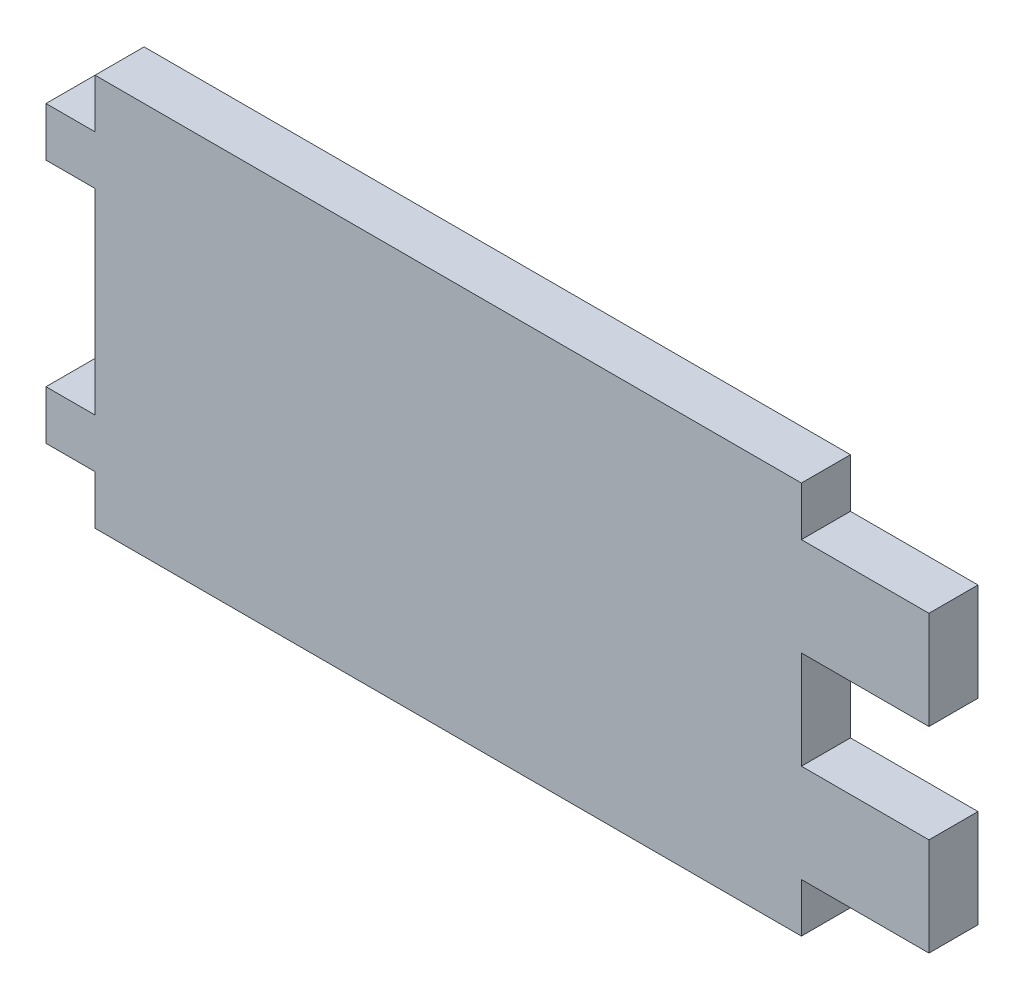
ISO-10303-21;
HEADER;
FILE_DESCRIPTION(('STEP AP214'),'2;1');
FILE_NAME('part.step','',(''),(''),'','','');
FILE_SCHEMA(('AUTOMOTIVE_DESIGN { 1 0 10303 214 1 1 1 1 }'));
ENDSEC;
DATA;
#1=APPLICATION_CONTEXT('core data for automotive mechanical design processes');
#2=APPLICATION_PROTOCOL_DEFINITION('international standard','automotive_design',2000,#1);
#3=PRODUCT_CONTEXT('',#1,'mechanical');
#4=PRODUCT('Part','Part','',(#3));
#5=PRODUCT_RELATED_PRODUCT_CATEGORY('part','',(#4));
#6=PRODUCT_DEFINITION_FORMATION('','',#4);
#7=PRODUCT_DEFINITION_CONTEXT('part definition',#1,'design');
#8=PRODUCT_DEFINITION('design','',#6,#7);
#9=PRODUCT_DEFINITION_SHAPE('','',#8);
#10=(LENGTH_UNIT() NAMED_UNIT(*) SI_UNIT(.MILLI.,.METRE.));
#11=(NAMED_UNIT(*) PLANE_ANGLE_UNIT() SI_UNIT($,.RADIAN.));
#12=(NAMED_UNIT(*) SI_UNIT($,.STERADIAN.) SOLID_ANGLE_UNIT());
#13=UNCERTAINTY_MEASURE_WITH_UNIT(LENGTH_MEASURE(1.E-05),#10,'distance_accuracy_value','');
#14=(GEOMETRIC_REPRESENTATION_CONTEXT(3) GLOBAL_UNCERTAINTY_ASSIGNED_CONTEXT((#13)) GLOBAL_UNIT_ASSIGNED_CONTEXT((#10,
#11,#12)) REPRESENTATION_CONTEXT('',''));
#15=CARTESIAN_POINT('',(0.,0.,0.));
#16=DIRECTION('',(0.,0.,1.));
#17=DIRECTION('',(1.,0.,0.));
#18=AXIS2_PLACEMENT_3D('',#15,#16,#17);
#19=CARTESIAN_POINT('',(0.,0.,5.));
#20=DIRECTION('',(1.,0.,0.));
#21=DIRECTION('',(0.,0.,-1.));
#22=AXIS2_PLACEMENT_3D('',#19,#20,#21);
#23=PLANE('',#22);
#24=DIRECTION('',(0.,-1.,0.));
#25=VECTOR('',#24,1.);
#26=CARTESIAN_POINT('',(0.,0.,0.));
#27=LINE('',#26,#25);
#28=CARTESIAN_POINT('',(0.,5.,0.));
#29=VERTEX_POINT('',#28);
#30=CARTESIAN_POINT('',(0.,0.,0.));
#31=VERTEX_POINT('',#30);
#32=EDGE_CURVE('E200',#29,#31,#27,.T.);
#33=ORIENTED_EDGE('',*,*,#32,.T.);
#34=DIRECTION('',(0.,0.,-1.));
#35=VECTOR('',#34,1.);
#36=CARTESIAN_POINT('',(0.,0.,5.));
#37=LINE('',#36,#35);
#38=CARTESIAN_POINT('',(0.,0.,5.));
#39=VERTEX_POINT('',#38);
#40=EDGE_CURVE('E11',#39,#31,#37,.T.);
#41=ORIENTED_EDGE('',*,*,#40,.F.);
#42=DIRECTION('',(0.,-1.,0.));
#43=VECTOR('',#42,1.);
#44=CARTESIAN_POINT('',(0.,0.,5.));
#45=LINE('',#44,#43);
#46=CARTESIAN_POINT('',(0.,5.,5.));
#47=VERTEX_POINT('',#46);
#48=EDGE_CURVE('E238',#47,#39,#45,.T.);
#49=ORIENTED_EDGE('',*,*,#48,.F.);
#50=DIRECTION('',(0.,0.,-1.));
#51=VECTOR('',#50,1.);
#52=CARTESIAN_POINT('',(0.,5.,5.));
#53=LINE('',#52,#51);
#54=EDGE_CURVE('E196',#47,#29,#53,.T.);
#55=ORIENTED_EDGE('',*,*,#54,.T.);
#56=EDGE_LOOP('',(#33,#41,#49,#55));
#57=FACE_BOUND('',#56,.T.);
#58=ADVANCED_FACE('F32',(#57),#23,.F.);
#59=CARTESIAN_POINT('',(0.,0.,5.));
#60=DIRECTION('',(0.,1.,0.));
#61=DIRECTION('',(0.,0.,1.));
#62=AXIS2_PLACEMENT_3D('',#59,#60,#61);
#63=PLANE('',#62);
#64=DIRECTION('',(1.,0.,0.));
#65=VECTOR('',#64,1.);
#66=CARTESIAN_POINT('',(0.,0.,0.));
#67=LINE('',#66,#65);
#68=CARTESIAN_POINT('',(72.,0.,0.));
#69=VERTEX_POINT('',#68);
#70=EDGE_CURVE('E203',#31,#69,#67,.T.);
#71=ORIENTED_EDGE('',*,*,#70,.T.);
#72=DIRECTION('',(0.,0.,-1.));
#73=VECTOR('',#72,1.);
#74=CARTESIAN_POINT('',(72.,0.,5.));
#75=LINE('',#74,#73);
#76=CARTESIAN_POINT('',(72.,0.,5.));
#77=VERTEX_POINT('',#76);
#78=EDGE_CURVE('E40',#77,#69,#75,.T.);
#79=ORIENTED_EDGE('',*,*,#78,.F.);
#80=DIRECTION('',(1.,0.,0.));
#81=VECTOR('',#80,1.);
#82=CARTESIAN_POINT('',(0.,0.,5.));
#83=LINE('',#82,#81);
#84=EDGE_CURVE('E127',#39,#77,#83,.T.);
#85=ORIENTED_EDGE('',*,*,#84,.F.);
#86=ORIENTED_EDGE('',*,*,#40,.T.);
#87=EDGE_LOOP('',(#71,#79,#85,#86));
#88=FACE_BOUND('',#87,.T.);
#89=ADVANCED_FACE('F356',(#88),#63,.F.);
#90=CARTESIAN_POINT('',(72.,0.,5.));
#91=DIRECTION('',(-1.,0.,0.));
#92=DIRECTION('',(0.,-1.,0.));
#93=AXIS2_PLACEMENT_3D('',#90,#91,#92);
#94=PLANE('',#93);
#95=DIRECTION('',(0.,1.,0.));
#96=VECTOR('',#95,1.);
#97=CARTESIAN_POINT('',(72.,0.,0.));
#98=LINE('',#97,#96);
#99=CARTESIAN_POINT('',(72.,5.,0.));
#100=VERTEX_POINT('',#99);
#101=EDGE_CURVE('E205',#69,#100,#98,.T.);
#102=ORIENTED_EDGE('',*,*,#101,.T.);
#103=DIRECTION('',(0.,0.,-1.));
#104=VECTOR('',#103,1.);
#105=CARTESIAN_POINT('',(72.,5.,5.));
#106=LINE('',#105,#104);
#107=CARTESIAN_POINT('',(72.,5.,5.));
#108=VERTEX_POINT('',#107);
#109=EDGE_CURVE('E281',#108,#100,#106,.T.);
#110=ORIENTED_EDGE('',*,*,#109,.F.);
#111=DIRECTION('',(0.,1.,0.));
#112=VECTOR('',#111,1.);
#113=CARTESIAN_POINT('',(72.,0.,5.));
#114=LINE('',#113,#112);
#115=EDGE_CURVE('E289',#77,#108,#114,.T.);
#116=ORIENTED_EDGE('',*,*,#115,.F.);
#117=ORIENTED_EDGE('',*,*,#78,.T.);
#118=EDGE_LOOP('',(#102,#110,#116,#117));
#119=FACE_BOUND('',#118,.T.);
#120=ADVANCED_FACE('F287',(#119),#94,.F.);
#121=CARTESIAN_POINT('',(72.,5.,5.));
#122=DIRECTION('',(0.,1.,0.));
#123=DIRECTION('',(0.,0.,1.));
#124=AXIS2_PLACEMENT_3D('',#121,#122,#123);
#125=PLANE('',#124);
#126=DIRECTION('',(1.,0.,0.));
#127=VECTOR('',#126,1.);
#128=CARTESIAN_POINT('',(72.,5.,0.));
#129=LINE('',#128,#127);
#130=CARTESIAN_POINT('',(85.,5.,0.));
#131=VERTEX_POINT('',#130);
#132=EDGE_CURVE('E207',#100,#131,#129,.T.);
#133=ORIENTED_EDGE('',*,*,#132,.T.);
#134=DIRECTION('',(0.,0.,-1.));
#135=VECTOR('',#134,1.);
#136=CARTESIAN_POINT('',(85.,5.,5.));
#137=LINE('',#136,#135);
#138=CARTESIAN_POINT('',(85.,5.,5.));
#139=VERTEX_POINT('',#138);
#140=EDGE_CURVE('E278',#139,#131,#137,.T.);
#141=ORIENTED_EDGE('',*,*,#140,.F.);
#142=DIRECTION('',(1.,0.,0.));
#143=VECTOR('',#142,1.);
#144=CARTESIAN_POINT('',(72.,5.,5.));
#145=LINE('',#144,#143);
#146=EDGE_CURVE('E307',#108,#139,#145,.T.);
#147=ORIENTED_EDGE('',*,*,#146,.F.);
#148=ORIENTED_EDGE('',*,*,#109,.T.);
#149=EDGE_LOOP('',(#133,#141,#147,#148));
#150=FACE_BOUND('',#149,.T.);
#151=ADVANCED_FACE('F298',(#150),#125,.F.);
#152=CARTESIAN_POINT('',(85.,5.,5.));
#153=DIRECTION('',(-1.,0.,0.));
#154=DIRECTION('',(0.,0.,1.));
#155=AXIS2_PLACEMENT_3D('',#152,#153,#154);
#156=PLANE('',#155);
#157=DIRECTION('',(0.,1.,0.));
#158=VECTOR('',#157,1.);
#159=CARTESIAN_POINT('',(85.,5.,0.));
#160=LINE('',#159,#158);
#161=CARTESIAN_POINT('',(85.,15.,0.));
#162=VERTEX_POINT('',#161);
#163=EDGE_CURVE('E209',#131,#162,#160,.T.);
#164=ORIENTED_EDGE('',*,*,#163,.T.);
#165=DIRECTION('',(0.,0.,-1.));
#166=VECTOR('',#165,1.);
#167=CARTESIAN_POINT('',(85.,15.,5.));
#168=LINE('',#167,#166);
#169=CARTESIAN_POINT('',(85.,15.,5.));
#170=VERTEX_POINT('',#169);
#171=EDGE_CURVE('E275',#170,#162,#168,.T.);
#172=ORIENTED_EDGE('',*,*,#171,.F.);
#173=DIRECTION('',(0.,1.,0.));
#174=VECTOR('',#173,1.);
#175=CARTESIAN_POINT('',(85.,5.,5.));
#176=LINE('',#175,#174);
#177=EDGE_CURVE('E304',#139,#170,#176,.T.);
#178=ORIENTED_EDGE('',*,*,#177,.F.);
#179=ORIENTED_EDGE('',*,*,#140,.T.);
#180=EDGE_LOOP('',(#164,#172,#178,#179));
#181=FACE_BOUND('',#180,.T.);
#182=ADVANCED_FACE('F302',(#181),#156,.F.);
#183=CARTESIAN_POINT('',(72.,15.,5.));
#184=DIRECTION('',(0.,-1.,0.));
#185=DIRECTION('',(0.,0.,-1.));
#186=AXIS2_PLACEMENT_3D('',#183,#184,#185);
#187=PLANE('',#186);
#188=DIRECTION('',(-1.,0.,0.));
#189=VECTOR('',#188,1.);
#190=CARTESIAN_POINT('',(72.,15.,0.));
#191=LINE('',#190,#189);
#192=CARTESIAN_POINT('',(72.,15.,0.));
#193=VERTEX_POINT('',#192);
#194=EDGE_CURVE('E211',#162,#193,#191,.T.);
#195=ORIENTED_EDGE('',*,*,#194,.T.);
#196=DIRECTION('',(0.,0.,-1.));
#197=VECTOR('',#196,1.);
#198=CARTESIAN_POINT('',(72.,15.,5.));
#199=LINE('',#198,#197);
#200=CARTESIAN_POINT('',(72.,15.,5.));
#201=VERTEX_POINT('',#200);
#202=EDGE_CURVE('E272',#201,#193,#199,.T.);
#203=ORIENTED_EDGE('',*,*,#202,.F.);
#204=DIRECTION('',(-1.,0.,0.));
#205=VECTOR('',#204,1.);
#206=CARTESIAN_POINT('',(72.,15.,5.));
#207=LINE('',#206,#205);
#208=EDGE_CURVE('E306',#170,#201,#207,.T.);
#209=ORIENTED_EDGE('',*,*,#208,.F.);
#210=ORIENTED_EDGE('',*,*,#171,.T.);
#211=EDGE_LOOP('',(#195,#203,#209,#210));
#212=FACE_BOUND('',#211,.T.);
#213=ADVANCED_FACE('F369',(#212),#187,.F.);
#214=CARTESIAN_POINT('',(72.,15.,5.));
#215=DIRECTION('',(-1.,0.,0.));
#216=DIRECTION('',(0.,0.,1.));
#217=AXIS2_PLACEMENT_3D('',#214,#215,#216);
#218=PLANE('',#217);
#219=DIRECTION('',(0.,1.,0.));
#220=VECTOR('',#219,1.);
#221=CARTESIAN_POINT('',(72.,15.,0.));
#222=LINE('',#221,#220);
#223=CARTESIAN_POINT('',(72.,25.,0.));
#224=VERTEX_POINT('',#223);
#225=EDGE_CURVE('E213',#193,#224,#222,.T.);
#226=ORIENTED_EDGE('',*,*,#225,.T.);
#227=DIRECTION('',(0.,0.,-1.));
#228=VECTOR('',#227,1.);
#229=CARTESIAN_POINT('',(72.,25.,5.));
#230=LINE('',#229,#228);
#231=CARTESIAN_POINT('',(72.,25.,5.));
#232=VERTEX_POINT('',#231);
#233=EDGE_CURVE('E269',#232,#224,#230,.T.);
#234=ORIENTED_EDGE('',*,*,#233,.F.);
#235=DIRECTION('',(0.,1.,0.));
#236=VECTOR('',#235,1.);
#237=CARTESIAN_POINT('',(72.,15.,5.));
#238=LINE('',#237,#236);
#239=EDGE_CURVE('E309',#201,#232,#238,.T.);
#240=ORIENTED_EDGE('',*,*,#239,.F.);
#241=ORIENTED_EDGE('',*,*,#202,.T.);
#242=EDGE_LOOP('',(#226,#234,#240,#241));
#243=FACE_BOUND('',#242,.T.);
#244=ADVANCED_FACE('F372',(#243),#218,.F.);
#245=CARTESIAN_POINT('',(72.,25.,5.));
#246=DIRECTION('',(0.,1.,0.));
#247=DIRECTION('',(0.,0.,1.));
#248=AXIS2_PLACEMENT_3D('',#245,#246,#247);
#249=PLANE('',#248);
#250=DIRECTION('',(1.,0.,0.));
#251=VECTOR('',#250,1.);
#252=CARTESIAN_POINT('',(72.,25.,0.));
#253=LINE('',#252,#251);
#254=CARTESIAN_POINT('',(85.,25.,0.));
#255=VERTEX_POINT('',#254);
#256=EDGE_CURVE('E215',#224,#255,#253,.T.);
#257=ORIENTED_EDGE('',*,*,#256,.T.);
#258=DIRECTION('',(0.,0.,-1.));
#259=VECTOR('',#258,1.);
#260=CARTESIAN_POINT('',(85.,25.,5.));
#261=LINE('',#260,#259);
#262=CARTESIAN_POINT('',(85.,25.,5.));
#263=VERTEX_POINT('',#262);
#264=EDGE_CURVE('E266',#263,#255,#261,.T.);
#265=ORIENTED_EDGE('',*,*,#264,.F.);
#266=DIRECTION('',(1.,0.,0.));
#267=VECTOR('',#266,1.);
#268=CARTESIAN_POINT('',(72.,25.,5.));
#269=LINE('',#268,#267);
#270=EDGE_CURVE('E315',#232,#263,#269,.T.);
#271=ORIENTED_EDGE('',*,*,#270,.F.);
#272=ORIENTED_EDGE('',*,*,#233,.T.);
#273=EDGE_LOOP('',(#257,#265,#271,#272));
#274=FACE_BOUND('',#273,.T.);
#275=ADVANCED_FACE('F376',(#274),#249,.F.);
#276=CARTESIAN_POINT('',(85.,35.,5.));
#277=DIRECTION('',(-1.,0.,0.));
#278=DIRECTION('',(0.,0.,1.));
#279=AXIS2_PLACEMENT_3D('',#276,#277,#278);
#280=PLANE('',#279);
#281=DIRECTION('',(0.,1.,0.));
#282=VECTOR('',#281,1.);
#283=CARTESIAN_POINT('',(85.,35.,0.));
#284=LINE('',#283,#282);
#285=CARTESIAN_POINT('',(85.,35.,0.));
#286=VERTEX_POINT('',#285);
#287=EDGE_CURVE('E217',#255,#286,#284,.T.);
#288=ORIENTED_EDGE('',*,*,#287,.T.);
#289=DIRECTION('',(0.,0.,-1.));
#290=VECTOR('',#289,1.);
#291=CARTESIAN_POINT('',(85.,35.,5.));
#292=LINE('',#291,#290);
#293=CARTESIAN_POINT('',(85.,35.,5.));
#294=VERTEX_POINT('',#293);
#295=EDGE_CURVE('E263',#294,#286,#292,.T.);
#296=ORIENTED_EDGE('',*,*,#295,.F.);
#297=DIRECTION('',(0.,1.,0.));
#298=VECTOR('',#297,1.);
#299=CARTESIAN_POINT('',(85.,35.,5.));
#300=LINE('',#299,#298);
#301=EDGE_CURVE('E317',#263,#294,#300,.T.);
#302=ORIENTED_EDGE('',*,*,#301,.F.);
#303=ORIENTED_EDGE('',*,*,#264,.T.);
#304=EDGE_LOOP('',(#288,#296,#302,#303));
#305=FACE_BOUND('',#304,.T.);
#306=ADVANCED_FACE('F380',(#305),#280,.F.);
#307=CARTESIAN_POINT('',(72.,35.,5.));
#308=DIRECTION('',(0.,-1.,0.));
#309=DIRECTION('',(0.,0.,-1.));
#310=AXIS2_PLACEMENT_3D('',#307,#308,#309);
#311=PLANE('',#310);
#312=DIRECTION('',(-1.,0.,0.));
#313=VECTOR('',#312,1.);
#314=CARTESIAN_POINT('',(72.,35.,0.));
#315=LINE('',#314,#313);
#316=CARTESIAN_POINT('',(72.,35.,0.));
#317=VERTEX_POINT('',#316);
#318=EDGE_CURVE('E219',#286,#317,#315,.T.);
#319=ORIENTED_EDGE('',*,*,#318,.T.);
#320=DIRECTION('',(0.,0.,-1.));
#321=VECTOR('',#320,1.);
#322=CARTESIAN_POINT('',(72.,35.,5.));
#323=LINE('',#322,#321);
#324=CARTESIAN_POINT('',(72.,35.,5.));
#325=VERTEX_POINT('',#324);
#326=EDGE_CURVE('E260',#325,#317,#323,.T.);
#327=ORIENTED_EDGE('',*,*,#326,.F.);
#328=DIRECTION('',(-1.,0.,0.));
#329=VECTOR('',#328,1.);
#330=CARTESIAN_POINT('',(72.,35.,5.));
#331=LINE('',#330,#329);
#332=EDGE_CURVE('E319',#294,#325,#331,.T.);
#333=ORIENTED_EDGE('',*,*,#332,.F.);
#334=ORIENTED_EDGE('',*,*,#295,.T.);
#335=EDGE_LOOP('',(#319,#327,#333,#334));
#336=FACE_BOUND('',#335,.T.);
#337=ADVANCED_FACE('F384',(#336),#311,.F.);
#338=CARTESIAN_POINT('',(72.,35.,5.));
#339=DIRECTION('',(-1.,0.,0.));
#340=DIRECTION('',(0.,0.,1.));
#341=AXIS2_PLACEMENT_3D('',#338,#339,#340);
#342=PLANE('',#341);
#343=DIRECTION('',(0.,1.,0.));
#344=VECTOR('',#343,1.);
#345=CARTESIAN_POINT('',(72.,35.,0.));
#346=LINE('',#345,#344);
#347=CARTESIAN_POINT('',(72.,40.,0.));
#348=VERTEX_POINT('',#347);
#349=EDGE_CURVE('E221',#317,#348,#346,.T.);
#350=ORIENTED_EDGE('',*,*,#349,.T.);
#351=DIRECTION('',(0.,0.,-1.));
#352=VECTOR('',#351,1.);
#353=CARTESIAN_POINT('',(72.,40.,5.));
#354=LINE('',#353,#352);
#355=CARTESIAN_POINT('',(72.,40.,5.));
#356=VERTEX_POINT('',#355);
#357=EDGE_CURVE('E257',#356,#348,#354,.T.);
#358=ORIENTED_EDGE('',*,*,#357,.F.);
#359=DIRECTION('',(0.,1.,0.));
#360=VECTOR('',#359,1.);
#361=CARTESIAN_POINT('',(72.,35.,5.));
#362=LINE('',#361,#360);
#363=EDGE_CURVE('E321',#325,#356,#362,.T.);
#364=ORIENTED_EDGE('',*,*,#363,.F.);
#365=ORIENTED_EDGE('',*,*,#326,.T.);
#366=EDGE_LOOP('',(#350,#358,#364,#365));
#367=FACE_BOUND('',#366,.T.);
#368=ADVANCED_FACE('F388',(#367),#342,.F.);
#369=CARTESIAN_POINT('',(0.,40.,5.));
#370=DIRECTION('',(0.,-1.,0.));
#371=DIRECTION('',(0.,0.,-1.));
#372=AXIS2_PLACEMENT_3D('',#369,#370,#371);
#373=PLANE('',#372);
#374=DIRECTION('',(-1.,0.,0.));
#375=VECTOR('',#374,1.);
#376=CARTESIAN_POINT('',(0.,40.,0.));
#377=LINE('',#376,#375);
#378=CARTESIAN_POINT('',(0.,40.,0.));
#379=VERTEX_POINT('',#378);
#380=EDGE_CURVE('E223',#348,#379,#377,.T.);
#381=ORIENTED_EDGE('',*,*,#380,.T.);
#382=DIRECTION('',(0.,0.,-1.));
#383=VECTOR('',#382,1.);
#384=CARTESIAN_POINT('',(0.,40.,5.));
#385=LINE('',#384,#383);
#386=CARTESIAN_POINT('',(0.,40.,5.));
#387=VERTEX_POINT('',#386);
#388=EDGE_CURVE('E254',#387,#379,#385,.T.);
#389=ORIENTED_EDGE('',*,*,#388,.F.);
#390=DIRECTION('',(-1.,0.,0.));
#391=VECTOR('',#390,1.);
#392=CARTESIAN_POINT('',(0.,40.,5.));
#393=LINE('',#392,#391);
#394=EDGE_CURVE('E323',#356,#387,#393,.T.);
#395=ORIENTED_EDGE('',*,*,#394,.F.);
#396=ORIENTED_EDGE('',*,*,#357,.T.);
#397=EDGE_LOOP('',(#381,#389,#395,#396));
#398=FACE_BOUND('',#397,.T.);
#399=ADVANCED_FACE('F392',(#398),#373,.F.);
#400=CARTESIAN_POINT('',(0.,35.,5.));
#401=DIRECTION('',(1.,0.,0.));
#402=DIRECTION('',(0.,0.,-1.));
#403=AXIS2_PLACEMENT_3D('',#400,#401,#402);
#404=PLANE('',#403);
#405=DIRECTION('',(0.,-1.,0.));
#406=VECTOR('',#405,1.);
#407=CARTESIAN_POINT('',(0.,35.,0.));
#408=LINE('',#407,#406);
#409=CARTESIAN_POINT('',(0.,35.,0.));
#410=VERTEX_POINT('',#409);
#411=EDGE_CURVE('E225',#379,#410,#408,.T.);
#412=ORIENTED_EDGE('',*,*,#411,.T.);
#413=DIRECTION('',(0.,0.,-1.));
#414=VECTOR('',#413,1.);
#415=CARTESIAN_POINT('',(0.,35.,5.));
#416=LINE('',#415,#414);
#417=CARTESIAN_POINT('',(0.,35.,5.));
#418=VERTEX_POINT('',#417);
#419=EDGE_CURVE('E251',#418,#410,#416,.T.);
#420=ORIENTED_EDGE('',*,*,#419,.F.);
#421=DIRECTION('',(0.,-1.,0.));
#422=VECTOR('',#421,1.);
#423=CARTESIAN_POINT('',(0.,35.,5.));
#424=LINE('',#423,#422);
#425=EDGE_CURVE('E325',#387,#418,#424,.T.);
#426=ORIENTED_EDGE('',*,*,#425,.F.);
#427=ORIENTED_EDGE('',*,*,#388,.T.);
#428=EDGE_LOOP('',(#412,#420,#426,#427));
#429=FACE_BOUND('',#428,.T.);
#430=ADVANCED_FACE('F396',(#429),#404,.F.);
#431=CARTESIAN_POINT('',(0.,35.,5.));
#432=DIRECTION('',(0.,-1.,0.));
#433=DIRECTION('',(0.,0.,-1.));
#434=AXIS2_PLACEMENT_3D('',#431,#432,#433);
#435=PLANE('',#434);
#436=DIRECTION('',(-1.,0.,0.));
#437=VECTOR('',#436,1.);
#438=CARTESIAN_POINT('',(0.,35.,0.));
#439=LINE('',#438,#437);
#440=CARTESIAN_POINT('',(-5.,35.,0.));
#441=VERTEX_POINT('',#440);
#442=EDGE_CURVE('E227',#410,#441,#439,.T.);
#443=ORIENTED_EDGE('',*,*,#442,.T.);
#444=DIRECTION('',(0.,0.,-1.));
#445=VECTOR('',#444,1.);
#446=CARTESIAN_POINT('',(-5.,35.,5.));
#447=LINE('',#446,#445);
#448=CARTESIAN_POINT('',(-5.,35.,5.));
#449=VERTEX_POINT('',#448);
#450=EDGE_CURVE('E248',#449,#441,#447,.T.);
#451=ORIENTED_EDGE('',*,*,#450,.F.);
#452=DIRECTION('',(-1.,0.,0.));
#453=VECTOR('',#452,1.);
#454=CARTESIAN_POINT('',(0.,35.,5.));
#455=LINE('',#454,#453);
#456=EDGE_CURVE('E327',#418,#449,#455,.T.);
#457=ORIENTED_EDGE('',*,*,#456,.F.);
#458=ORIENTED_EDGE('',*,*,#419,.T.);
#459=EDGE_LOOP('',(#443,#451,#457,#458));
#460=FACE_BOUND('',#459,.T.);
#461=ADVANCED_FACE('F400',(#460),#435,.F.);
#462=CARTESIAN_POINT('',(-5.,35.,5.));
#463=DIRECTION('',(1.,0.,0.));
#464=DIRECTION('',(0.,1.,0.));
#465=AXIS2_PLACEMENT_3D('',#462,#463,#464);
#466=PLANE('',#465);
#467=DIRECTION('',(0.,-1.,0.));
#468=VECTOR('',#467,1.);
#469=CARTESIAN_POINT('',(-5.,35.,0.));
#470=LINE('',#469,#468);
#471=CARTESIAN_POINT('',(-5.,30.,0.));
#472=VERTEX_POINT('',#471);
#473=EDGE_CURVE('E229',#441,#472,#470,.T.);
#474=ORIENTED_EDGE('',*,*,#473,.T.);
#475=DIRECTION('',(0.,0.,-1.));
#476=VECTOR('',#475,1.);
#477=CARTESIAN_POINT('',(-5.,30.,5.));
#478=LINE('',#477,#476);
#479=CARTESIAN_POINT('',(-5.,30.,5.));
#480=VERTEX_POINT('',#479);
#481=EDGE_CURVE('E245',#480,#472,#478,.T.);
#482=ORIENTED_EDGE('',*,*,#481,.F.);
#483=DIRECTION('',(0.,-1.,0.));
#484=VECTOR('',#483,1.);
#485=CARTESIAN_POINT('',(-5.,35.,5.));
#486=LINE('',#485,#484);
#487=EDGE_CURVE('E329',#449,#480,#486,.T.);
#488=ORIENTED_EDGE('',*,*,#487,.F.);
#489=ORIENTED_EDGE('',*,*,#450,.T.);
#490=EDGE_LOOP('',(#474,#482,#488,#489));
#491=FACE_BOUND('',#490,.T.);
#492=ADVANCED_FACE('F404',(#491),#466,.F.);
#493=CARTESIAN_POINT('',(0.,30.,5.));
#494=DIRECTION('',(0.,1.,0.));
#495=DIRECTION('',(0.,0.,1.));
#496=AXIS2_PLACEMENT_3D('',#493,#494,#495);
#497=PLANE('',#496);
#498=DIRECTION('',(1.,0.,0.));
#499=VECTOR('',#498,1.);
#500=CARTESIAN_POINT('',(0.,30.,0.));
#501=LINE('',#500,#499);
#502=CARTESIAN_POINT('',(0.,30.,0.));
#503=VERTEX_POINT('',#502);
#504=EDGE_CURVE('E231',#472,#503,#501,.T.);
#505=ORIENTED_EDGE('',*,*,#504,.T.);
#506=DIRECTION('',(0.,0.,-1.));
#507=VECTOR('',#506,1.);
#508=CARTESIAN_POINT('',(0.,30.,5.));
#509=LINE('',#508,#507);
#510=CARTESIAN_POINT('',(0.,30.,5.));
#511=VERTEX_POINT('',#510);
#512=EDGE_CURVE('E242',#511,#503,#509,.T.);
#513=ORIENTED_EDGE('',*,*,#512,.F.);
#514=DIRECTION('',(1.,0.,0.));
#515=VECTOR('',#514,1.);
#516=CARTESIAN_POINT('',(0.,30.,5.));
#517=LINE('',#516,#515);
#518=EDGE_CURVE('E331',#480,#511,#517,.T.);
#519=ORIENTED_EDGE('',*,*,#518,.F.);
#520=ORIENTED_EDGE('',*,*,#481,.T.);
#521=EDGE_LOOP('',(#505,#513,#519,#520));
#522=FACE_BOUND('',#521,.T.);
#523=ADVANCED_FACE('F337',(#522),#497,.F.);
#524=CARTESIAN_POINT('',(0.,10.,5.));
#525=DIRECTION('',(1.,0.,0.));
#526=DIRECTION('',(0.,0.,-1.));
#527=AXIS2_PLACEMENT_3D('',#524,#525,#526);
#528=PLANE('',#527);
#529=DIRECTION('',(0.,-1.,0.));
#530=VECTOR('',#529,1.);
#531=CARTESIAN_POINT('',(0.,10.,0.));
#532=LINE('',#531,#530);
#533=CARTESIAN_POINT('',(0.,10.,0.));
#534=VERTEX_POINT('',#533);
#535=EDGE_CURVE('E233',#503,#534,#532,.T.);
#536=ORIENTED_EDGE('',*,*,#535,.T.);
#537=DIRECTION('',(0.,0.,-1.));
#538=VECTOR('',#537,1.);
#539=CARTESIAN_POINT('',(0.,10.,5.));
#540=LINE('',#539,#538);
#541=CARTESIAN_POINT('',(0.,10.,5.));
#542=VERTEX_POINT('',#541);
#543=EDGE_CURVE('E191',#542,#534,#540,.T.);
#544=ORIENTED_EDGE('',*,*,#543,.F.);
#545=DIRECTION('',(0.,-1.,0.));
#546=VECTOR('',#545,1.);
#547=CARTESIAN_POINT('',(0.,10.,5.));
#548=LINE('',#547,#546);
#549=EDGE_CURVE('E182',#511,#542,#548,.T.);
#550=ORIENTED_EDGE('',*,*,#549,.F.);
#551=ORIENTED_EDGE('',*,*,#512,.T.);
#552=EDGE_LOOP('',(#536,#544,#550,#551));
#553=FACE_BOUND('',#552,.T.);
#554=ADVANCED_FACE('F341',(#553),#528,.F.);
#555=CARTESIAN_POINT('',(0.,10.,5.));
#556=DIRECTION('',(0.,-1.,0.));
#557=DIRECTION('',(0.,0.,-1.));
#558=AXIS2_PLACEMENT_3D('',#555,#556,#557);
#559=PLANE('',#558);
#560=DIRECTION('',(-1.,0.,0.));
#561=VECTOR('',#560,1.);
#562=CARTESIAN_POINT('',(0.,10.,0.));
#563=LINE('',#562,#561);
#564=CARTESIAN_POINT('',(-5.,10.,0.));
#565=VERTEX_POINT('',#564);
#566=EDGE_CURVE('E190',#534,#565,#563,.T.);
#567=ORIENTED_EDGE('',*,*,#566,.T.);
#568=DIRECTION('',(0.,0.,-1.));
#569=VECTOR('',#568,1.);
#570=CARTESIAN_POINT('',(-5.,10.,5.));
#571=LINE('',#570,#569);
#572=CARTESIAN_POINT('',(-5.,10.,5.));
#573=VERTEX_POINT('',#572);
#574=EDGE_CURVE('E187',#573,#565,#571,.T.);
#575=ORIENTED_EDGE('',*,*,#574,.F.);
#576=DIRECTION('',(-1.,0.,0.));
#577=VECTOR('',#576,1.);
#578=CARTESIAN_POINT('',(0.,10.,5.));
#579=LINE('',#578,#577);
#580=EDGE_CURVE('E176',#542,#573,#579,.T.);
#581=ORIENTED_EDGE('',*,*,#580,.F.);
#582=ORIENTED_EDGE('',*,*,#543,.T.);
#583=EDGE_LOOP('',(#567,#575,#581,#582));
#584=FACE_BOUND('',#583,.T.);
#585=ADVANCED_FACE('F188',(#584),#559,.F.);
#586=CARTESIAN_POINT('',(-5.,5.,5.));
#587=DIRECTION('',(1.,0.,0.));
#588=DIRECTION('',(0.,1.,0.));
#589=AXIS2_PLACEMENT_3D('',#586,#587,#588);
#590=PLANE('',#589);
#591=DIRECTION('',(0.,-1.,0.));
#592=VECTOR('',#591,1.);
#593=CARTESIAN_POINT('',(-5.,5.,0.));
#594=LINE('',#593,#592);
#595=CARTESIAN_POINT('',(-5.,5.,0.));
#596=VERTEX_POINT('',#595);
#597=EDGE_CURVE('E113',#565,#596,#594,.T.);
#598=ORIENTED_EDGE('',*,*,#597,.T.);
#599=DIRECTION('',(0.,0.,-1.));
#600=VECTOR('',#599,1.);
#601=CARTESIAN_POINT('',(-5.,5.,5.));
#602=LINE('',#601,#600);
#603=CARTESIAN_POINT('',(-5.,5.,5.));
#604=VERTEX_POINT('',#603);
#605=EDGE_CURVE('E192',#604,#596,#602,.T.);
#606=ORIENTED_EDGE('',*,*,#605,.F.);
#607=DIRECTION('',(0.,-1.,0.));
#608=VECTOR('',#607,1.);
#609=CARTESIAN_POINT('',(-5.,5.,5.));
#610=LINE('',#609,#608);
#611=EDGE_CURVE('E180',#573,#604,#610,.T.);
#612=ORIENTED_EDGE('',*,*,#611,.F.);
#613=ORIENTED_EDGE('',*,*,#574,.T.);
#614=EDGE_LOOP('',(#598,#606,#612,#613));
#615=FACE_BOUND('',#614,.T.);
#616=ADVANCED_FACE('F194',(#615),#590,.F.);
#617=CARTESIAN_POINT('',(0.,5.,5.));
#618=DIRECTION('',(0.,1.,0.));
#619=DIRECTION('',(-1.,0.,0.));
#620=AXIS2_PLACEMENT_3D('',#617,#618,#619);
#621=PLANE('',#620);
#622=DIRECTION('',(1.,0.,0.));
#623=VECTOR('',#622,1.);
#624=CARTESIAN_POINT('',(0.,5.,0.));
#625=LINE('',#624,#623);
#626=EDGE_CURVE('E119',#596,#29,#625,.T.);
#627=ORIENTED_EDGE('',*,*,#626,.T.);
#628=ORIENTED_EDGE('',*,*,#54,.F.);
#629=DIRECTION('',(1.,0.,0.));
#630=VECTOR('',#629,1.);
#631=CARTESIAN_POINT('',(0.,5.,5.));
#632=LINE('',#631,#630);
#633=EDGE_CURVE('E48',#604,#47,#632,.T.);
#634=ORIENTED_EDGE('',*,*,#633,.F.);
#635=ORIENTED_EDGE('',*,*,#605,.T.);
#636=EDGE_LOOP('',(#627,#628,#634,#635));
#637=FACE_BOUND('',#636,.T.);
#638=ADVANCED_FACE('F345',(#637),#621,.F.);
#639=CARTESIAN_POINT('',(0.,0.,5.));
#640=DIRECTION('',(0.,0.,1.));
#641=DIRECTION('',(1.,0.,0.));
#642=AXIS2_PLACEMENT_3D('',#639,#640,#641);
#643=PLANE('',#642);
#644=ORIENTED_EDGE('',*,*,#48,.T.);
#645=ORIENTED_EDGE('',*,*,#84,.T.);
#646=ORIENTED_EDGE('',*,*,#115,.T.);
#647=ORIENTED_EDGE('',*,*,#146,.T.);
#648=ORIENTED_EDGE('',*,*,#177,.T.);
#649=ORIENTED_EDGE('',*,*,#208,.T.);
#650=ORIENTED_EDGE('',*,*,#239,.T.);
#651=ORIENTED_EDGE('',*,*,#270,.T.);
#652=ORIENTED_EDGE('',*,*,#301,.T.);
#653=ORIENTED_EDGE('',*,*,#332,.T.);
#654=ORIENTED_EDGE('',*,*,#363,.T.);
#655=ORIENTED_EDGE('',*,*,#394,.T.);
#656=ORIENTED_EDGE('',*,*,#425,.T.);
#657=ORIENTED_EDGE('',*,*,#456,.T.);
#658=ORIENTED_EDGE('',*,*,#487,.T.);
#659=ORIENTED_EDGE('',*,*,#518,.T.);
#660=ORIENTED_EDGE('',*,*,#549,.T.);
#661=ORIENTED_EDGE('',*,*,#580,.T.);
#662=ORIENTED_EDGE('',*,*,#611,.T.);
#663=ORIENTED_EDGE('',*,*,#633,.T.);
#664=EDGE_LOOP('',(#644,#645,#646,#647,#648,#649,#650,#651,#652,#653,#654,#655,#656,#657,#658,
#659,#660,#661,#662,#663));
#665=FACE_BOUND('',#664,.T.);
#666=ADVANCED_FACE('F178',(#665),#643,.T.);
#667=CARTESIAN_POINT('',(0.,0.,0.));
#668=DIRECTION('',(0.,0.,1.));
#669=DIRECTION('',(1.,0.,0.));
#670=AXIS2_PLACEMENT_3D('',#667,#668,#669);
#671=PLANE('',#670);
#672=ORIENTED_EDGE('',*,*,#32,.F.);
#673=ORIENTED_EDGE('',*,*,#626,.F.);
#674=ORIENTED_EDGE('',*,*,#597,.F.);
#675=ORIENTED_EDGE('',*,*,#566,.F.);
#676=ORIENTED_EDGE('',*,*,#535,.F.);
#677=ORIENTED_EDGE('',*,*,#504,.F.);
#678=ORIENTED_EDGE('',*,*,#473,.F.);
#679=ORIENTED_EDGE('',*,*,#442,.F.);
#680=ORIENTED_EDGE('',*,*,#411,.F.);
#681=ORIENTED_EDGE('',*,*,#380,.F.);
#682=ORIENTED_EDGE('',*,*,#349,.F.);
#683=ORIENTED_EDGE('',*,*,#318,.F.);
#684=ORIENTED_EDGE('',*,*,#287,.F.);
#685=ORIENTED_EDGE('',*,*,#256,.F.);
#686=ORIENTED_EDGE('',*,*,#225,.F.);
#687=ORIENTED_EDGE('',*,*,#194,.F.);
#688=ORIENTED_EDGE('',*,*,#163,.F.);
#689=ORIENTED_EDGE('',*,*,#132,.F.);
#690=ORIENTED_EDGE('',*,*,#101,.F.);
#691=ORIENTED_EDGE('',*,*,#70,.F.);
#692=EDGE_LOOP('',(#672,#673,#674,#675,#676,#677,#678,#679,#680,#681,#682,#683,#684,#685,#686,
#687,#688,#689,#690,#691));
#693=FACE_BOUND('',#692,.T.);
#694=ADVANCED_FACE('F293',(#693),#671,.F.);
#695=CLOSED_SHELL('',(#58,#89,#120,#151,#182,#213,#244,#275,#306,#337,#368,#399,#430,#461,#492,
#523,#554,#585,#616,#638,#666,#694));
#696=MANIFOLD_SOLID_BREP('B2',#695);
#697=ADVANCED_BREP_SHAPE_REPRESENTATION('',(#18,#696),#14);
#698=SHAPE_DEFINITION_REPRESENTATION(#9,#697);
ENDSEC;
END-ISO-10303-21;
